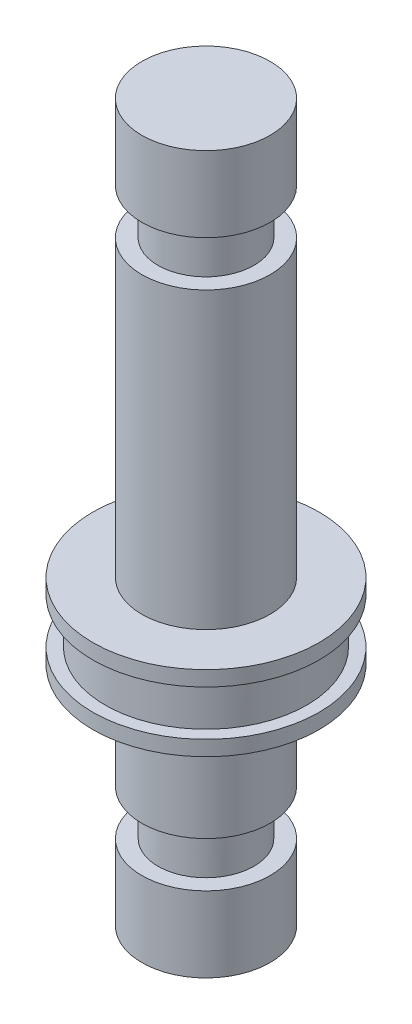
ISO-10303-21;
HEADER;
FILE_DESCRIPTION(('STEP AP214'),'2;1');
FILE_NAME('part.step','',(''),(''),'','','');
FILE_SCHEMA(('AUTOMOTIVE_DESIGN { 1 0 10303 214 1 1 1 1 }'));
ENDSEC;
DATA;
#1=APPLICATION_CONTEXT('core data for automotive mechanical design processes');
#2=APPLICATION_PROTOCOL_DEFINITION('international standard','automotive_design',2000,#1);
#3=PRODUCT_CONTEXT('',#1,'mechanical');
#4=PRODUCT('Part','Part','',(#3));
#5=PRODUCT_RELATED_PRODUCT_CATEGORY('part','',(#4));
#6=PRODUCT_DEFINITION_FORMATION('','',#4);
#7=PRODUCT_DEFINITION_CONTEXT('part definition',#1,'design');
#8=PRODUCT_DEFINITION('design','',#6,#7);
#9=PRODUCT_DEFINITION_SHAPE('','',#8);
#10=(LENGTH_UNIT() NAMED_UNIT(*) SI_UNIT(.MILLI.,.METRE.));
#11=(NAMED_UNIT(*) PLANE_ANGLE_UNIT() SI_UNIT($,.RADIAN.));
#12=(NAMED_UNIT(*) SI_UNIT($,.STERADIAN.) SOLID_ANGLE_UNIT());
#13=UNCERTAINTY_MEASURE_WITH_UNIT(LENGTH_MEASURE(1.E-05),#10,'distance_accuracy_value','');
#14=(GEOMETRIC_REPRESENTATION_CONTEXT(3) GLOBAL_UNCERTAINTY_ASSIGNED_CONTEXT((#13)) GLOBAL_UNIT_ASSIGNED_CONTEXT((#10,
#11,#12)) REPRESENTATION_CONTEXT('',''));
#15=CARTESIAN_POINT('',(0.,0.,0.));
#16=DIRECTION('',(0.,0.,1.));
#17=DIRECTION('',(1.,0.,0.));
#18=AXIS2_PLACEMENT_3D('',#15,#16,#17);
#19=CARTESIAN_POINT('',(0.,65.,0.));
#20=DIRECTION('',(0.,-1.,0.));
#21=DIRECTION('',(0.,0.,-1.));
#22=AXIS2_PLACEMENT_3D('',#19,#20,#21);
#23=CYLINDRICAL_SURFACE('',#22,6.365);
#24=CARTESIAN_POINT('',(0.,49.,0.));
#25=DIRECTION('',(0.,1.,0.));
#26=DIRECTION('',(0.,0.,1.));
#27=AXIS2_PLACEMENT_3D('',#24,#25,#26);
#28=CIRCLE('',#27,6.365);
#29=CARTESIAN_POINT('',(0.,49.,6.365));
#30=VERTEX_POINT('',#29);
#31=EDGE_CURVE('E12',#30,#30,#28,.F.);
#32=ORIENTED_EDGE('',*,*,#31,.F.);
#33=EDGE_LOOP('',(#32));
#34=FACE_BOUND('',#33,.T.);
#35=CARTESIAN_POINT('',(0.,55.,0.));
#36=DIRECTION('',(0.,1.,0.));
#37=DIRECTION('',(0.,0.,1.));
#38=AXIS2_PLACEMENT_3D('',#35,#36,#37);
#39=CIRCLE('',#38,6.365);
#40=CARTESIAN_POINT('',(0.,55.,6.365));
#41=VERTEX_POINT('',#40);
#42=EDGE_CURVE('E53',#41,#41,#39,.F.);
#43=ORIENTED_EDGE('',*,*,#42,.T.);
#44=EDGE_LOOP('',(#43));
#45=FACE_BOUND('',#44,.T.);
#46=ADVANCED_FACE('F34',(#34,#45),#23,.T.);
#47=CARTESIAN_POINT('',(0.,55.,0.));
#48=DIRECTION('',(0.,1.,0.));
#49=DIRECTION('',(0.,0.,1.));
#50=AXIS2_PLACEMENT_3D('',#47,#48,#49);
#51=CYLINDRICAL_SURFACE('',#50,8.5);
#52=CARTESIAN_POINT('',(0.,55.,0.));
#53=DIRECTION('',(0.,1.,0.));
#54=DIRECTION('',(0.,0.,1.));
#55=AXIS2_PLACEMENT_3D('',#52,#53,#54);
#56=CIRCLE('',#55,8.5);
#57=CARTESIAN_POINT('',(0.,55.,8.5));
#58=VERTEX_POINT('',#57);
#59=EDGE_CURVE('E62',#58,#58,#56,.T.);
#60=ORIENTED_EDGE('',*,*,#59,.T.);
#61=EDGE_LOOP('',(#60));
#62=FACE_BOUND('',#61,.T.);
#63=CARTESIAN_POINT('',(0.,65.,0.));
#64=DIRECTION('',(0.,1.,0.));
#65=DIRECTION('',(0.,0.,1.));
#66=AXIS2_PLACEMENT_3D('',#63,#64,#65);
#67=CIRCLE('',#66,8.5);
#68=CARTESIAN_POINT('',(0.,65.,8.5));
#69=VERTEX_POINT('',#68);
#70=EDGE_CURVE('E57',#69,#69,#67,.T.);
#71=ORIENTED_EDGE('',*,*,#70,.F.);
#72=EDGE_LOOP('',(#71));
#73=FACE_BOUND('',#72,.T.);
#74=ADVANCED_FACE('F125',(#62,#73),#51,.T.);
#75=CARTESIAN_POINT('',(0.,55.,0.));
#76=DIRECTION('',(0.,1.,0.));
#77=DIRECTION('',(0.,0.,1.));
#78=AXIS2_PLACEMENT_3D('',#75,#76,#77);
#79=PLANE('',#78);
#80=ORIENTED_EDGE('',*,*,#42,.F.);
#81=EDGE_LOOP('',(#80));
#82=FACE_BOUND('',#81,.T.);
#83=ORIENTED_EDGE('',*,*,#59,.F.);
#84=EDGE_LOOP('',(#83));
#85=FACE_BOUND('',#84,.T.);
#86=ADVANCED_FACE('F131',(#82,#85),#79,.F.);
#87=CARTESIAN_POINT('',(0.,65.,0.));
#88=DIRECTION('',(0.,-1.,0.));
#89=DIRECTION('',(0.,0.,-1.));
#90=AXIS2_PLACEMENT_3D('',#87,#88,#89);
#91=PLANE('',#90);
#92=ORIENTED_EDGE('',*,*,#70,.T.);
#93=EDGE_LOOP('',(#92));
#94=FACE_BOUND('',#93,.T.);
#95=ADVANCED_FACE('F249',(#94),#91,.F.);
#96=CARTESIAN_POINT('',(0.,79.0416305603426,0.));
#97=DIRECTION('',(0.,-1.,0.));
#98=DIRECTION('',(0.,0.,-1.));
#99=AXIS2_PLACEMENT_3D('',#96,#97,#98);
#100=CYLINDRICAL_SURFACE('',#99,8.5);
#101=CARTESIAN_POINT('',(0.,9.99999999999999,0.));
#102=DIRECTION('',(0.,1.,0.));
#103=DIRECTION('',(0.,0.,1.));
#104=AXIS2_PLACEMENT_3D('',#101,#102,#103);
#105=CIRCLE('',#104,8.5);
#106=CARTESIAN_POINT('',(0.,9.99999999999999,8.5));
#107=VERTEX_POINT('',#106);
#108=EDGE_CURVE('E58',#107,#107,#105,.F.);
#109=ORIENTED_EDGE('',*,*,#108,.F.);
#110=EDGE_LOOP('',(#109));
#111=FACE_BOUND('',#110,.T.);
#112=CARTESIAN_POINT('',(0.,49.,0.));
#113=DIRECTION('',(0.,1.,0.));
#114=DIRECTION('',(0.,0.,1.));
#115=AXIS2_PLACEMENT_3D('',#112,#113,#114);
#116=CIRCLE('',#115,8.5);
#117=CARTESIAN_POINT('',(0.,49.,8.5));
#118=VERTEX_POINT('',#117);
#119=EDGE_CURVE('E65',#118,#118,#116,.T.);
#120=ORIENTED_EDGE('',*,*,#119,.F.);
#121=EDGE_LOOP('',(#120));
#122=FACE_BOUND('',#121,.T.);
#123=ADVANCED_FACE('F233',(#111,#122),#100,.T.);
#124=CARTESIAN_POINT('',(0.,49.,0.));
#125=DIRECTION('',(0.,1.,0.));
#126=DIRECTION('',(0.,0.,1.));
#127=AXIS2_PLACEMENT_3D('',#124,#125,#126);
#128=PLANE('',#127);
#129=ORIENTED_EDGE('',*,*,#31,.T.);
#130=EDGE_LOOP('',(#129));
#131=FACE_BOUND('',#130,.T.);
#132=ORIENTED_EDGE('',*,*,#119,.T.);
#133=EDGE_LOOP('',(#132));
#134=FACE_BOUND('',#133,.T.);
#135=ADVANCED_FACE('F193',(#131,#134),#128,.T.);
#136=CARTESIAN_POINT('',(0.,8.,0.));
#137=DIRECTION('',(0.,1.,0.));
#138=DIRECTION('',(0.,0.,1.));
#139=AXIS2_PLACEMENT_3D('',#136,#137,#138);
#140=PLANE('',#139);
#141=CARTESIAN_POINT('',(0.,8.,0.));
#142=DIRECTION('',(0.,1.,0.));
#143=DIRECTION('',(0.,0.,1.));
#144=AXIS2_PLACEMENT_3D('',#141,#142,#143);
#145=CIRCLE('',#144,13.365);
#146=CARTESIAN_POINT('',(0.,8.,13.365));
#147=VERTEX_POINT('',#146);
#148=EDGE_CURVE('E50',#147,#147,#145,.T.);
#149=ORIENTED_EDGE('',*,*,#148,.T.);
#150=EDGE_LOOP('',(#149));
#151=FACE_BOUND('',#150,.T.);
#152=CARTESIAN_POINT('',(0.,8.,0.));
#153=DIRECTION('',(0.,1.,0.));
#154=DIRECTION('',(0.,0.,1.));
#155=AXIS2_PLACEMENT_3D('',#152,#153,#154);
#156=CIRCLE('',#155,15.);
#157=CARTESIAN_POINT('',(0.,8.,15.));
#158=VERTEX_POINT('',#157);
#159=EDGE_CURVE('E90',#158,#158,#156,.T.);
#160=ORIENTED_EDGE('',*,*,#159,.F.);
#161=EDGE_LOOP('',(#160));
#162=FACE_BOUND('',#161,.T.);
#163=ADVANCED_FACE('F187',(#151,#162),#140,.F.);
#164=CARTESIAN_POINT('',(0.,8.,0.));
#165=DIRECTION('',(0.,1.,0.));
#166=DIRECTION('',(0.,0.,1.));
#167=AXIS2_PLACEMENT_3D('',#164,#165,#166);
#168=CYLINDRICAL_SURFACE('',#167,15.);
#169=ORIENTED_EDGE('',*,*,#159,.T.);
#170=EDGE_LOOP('',(#169));
#171=FACE_BOUND('',#170,.T.);
#172=CARTESIAN_POINT('',(0.,10.,0.));
#173=DIRECTION('',(0.,1.,0.));
#174=DIRECTION('',(0.,0.,1.));
#175=AXIS2_PLACEMENT_3D('',#172,#173,#174);
#176=CIRCLE('',#175,15.);
#177=CARTESIAN_POINT('',(0.,10.,15.));
#178=VERTEX_POINT('',#177);
#179=EDGE_CURVE('E86',#178,#178,#176,.T.);
#180=ORIENTED_EDGE('',*,*,#179,.F.);
#181=EDGE_LOOP('',(#180));
#182=FACE_BOUND('',#181,.T.);
#183=ADVANCED_FACE('F192',(#171,#182),#168,.T.);
#184=CARTESIAN_POINT('',(0.,10.,0.));
#185=DIRECTION('',(0.,1.,0.));
#186=DIRECTION('',(0.,0.,1.));
#187=AXIS2_PLACEMENT_3D('',#184,#185,#186);
#188=PLANE('',#187);
#189=ORIENTED_EDGE('',*,*,#108,.T.);
#190=EDGE_LOOP('',(#189));
#191=FACE_BOUND('',#190,.T.);
#192=ORIENTED_EDGE('',*,*,#179,.T.);
#193=EDGE_LOOP('',(#192));
#194=FACE_BOUND('',#193,.T.);
#195=ADVANCED_FACE('F180',(#191,#194),#188,.T.);
#196=CARTESIAN_POINT('',(0.,10.,0.));
#197=DIRECTION('',(0.,-1.,0.));
#198=DIRECTION('',(0.,0.,-1.));
#199=AXIS2_PLACEMENT_3D('',#196,#197,#198);
#200=CYLINDRICAL_SURFACE('',#199,13.365);
#201=ORIENTED_EDGE('',*,*,#148,.F.);
#202=EDGE_LOOP('',(#201));
#203=FACE_BOUND('',#202,.T.);
#204=CARTESIAN_POINT('',(0.,2.,0.));
#205=DIRECTION('',(0.,-1.,0.));
#206=DIRECTION('',(0.,0.,-1.));
#207=AXIS2_PLACEMENT_3D('',#204,#205,#206);
#208=CIRCLE('',#207,13.365);
#209=CARTESIAN_POINT('',(0.,2.,-13.365));
#210=VERTEX_POINT('',#209);
#211=EDGE_CURVE('E45',#210,#210,#208,.T.);
#212=ORIENTED_EDGE('',*,*,#211,.F.);
#213=EDGE_LOOP('',(#212));
#214=FACE_BOUND('',#213,.T.);
#215=ADVANCED_FACE('F36',(#203,#214),#200,.T.);
#216=CARTESIAN_POINT('',(0.,2.,0.));
#217=DIRECTION('',(0.,-1.,0.));
#218=DIRECTION('',(0.,0.,-1.));
#219=AXIS2_PLACEMENT_3D('',#216,#217,#218);
#220=PLANE('',#219);
#221=ORIENTED_EDGE('',*,*,#211,.T.);
#222=EDGE_LOOP('',(#221));
#223=FACE_BOUND('',#222,.T.);
#224=CARTESIAN_POINT('',(0.,2.,0.));
#225=DIRECTION('',(0.,-1.,0.));
#226=DIRECTION('',(0.,0.,-1.));
#227=AXIS2_PLACEMENT_3D('',#224,#225,#226);
#228=CIRCLE('',#227,15.);
#229=CARTESIAN_POINT('',(0.,2.,-15.));
#230=VERTEX_POINT('',#229);
#231=EDGE_CURVE('E83',#230,#230,#228,.T.);
#232=ORIENTED_EDGE('',*,*,#231,.F.);
#233=EDGE_LOOP('',(#232));
#234=FACE_BOUND('',#233,.T.);
#235=ADVANCED_FACE('F154',(#223,#234),#220,.F.);
#236=CARTESIAN_POINT('',(0.,2.,0.));
#237=DIRECTION('',(0.,-1.,0.));
#238=DIRECTION('',(0.,0.,-1.));
#239=AXIS2_PLACEMENT_3D('',#236,#237,#238);
#240=CYLINDRICAL_SURFACE('',#239,15.);
#241=ORIENTED_EDGE('',*,*,#231,.T.);
#242=EDGE_LOOP('',(#241));
#243=FACE_BOUND('',#242,.T.);
#244=CARTESIAN_POINT('',(0.,0.,0.));
#245=DIRECTION('',(0.,-1.,0.));
#246=DIRECTION('',(0.,0.,-1.));
#247=AXIS2_PLACEMENT_3D('',#244,#245,#246);
#248=CIRCLE('',#247,15.);
#249=CARTESIAN_POINT('',(0.,0.,-15.));
#250=VERTEX_POINT('',#249);
#251=EDGE_CURVE('E87',#250,#250,#248,.T.);
#252=ORIENTED_EDGE('',*,*,#251,.F.);
#253=EDGE_LOOP('',(#252));
#254=FACE_BOUND('',#253,.T.);
#255=ADVANCED_FACE('F159',(#243,#254),#240,.T.);
#256=CARTESIAN_POINT('',(0.,0.,0.));
#257=DIRECTION('',(0.,1.,0.));
#258=DIRECTION('',(0.,0.,1.));
#259=AXIS2_PLACEMENT_3D('',#256,#257,#258);
#260=PLANE('',#259);
#261=CARTESIAN_POINT('',(0.,0.,0.));
#262=DIRECTION('',(0.,1.,0.));
#263=DIRECTION('',(0.,0.,1.));
#264=AXIS2_PLACEMENT_3D('',#261,#262,#263);
#265=CIRCLE('',#264,8.5);
#266=CARTESIAN_POINT('',(0.,0.,8.5));
#267=VERTEX_POINT('',#266);
#268=EDGE_CURVE('E41',#267,#267,#265,.F.);
#269=ORIENTED_EDGE('',*,*,#268,.F.);
#270=EDGE_LOOP('',(#269));
#271=FACE_BOUND('',#270,.T.);
#272=ORIENTED_EDGE('',*,*,#251,.T.);
#273=EDGE_LOOP('',(#272));
#274=FACE_BOUND('',#273,.T.);
#275=ADVANCED_FACE('F170',(#271,#274),#260,.F.);
#276=CARTESIAN_POINT('',(0.,-14.,0.));
#277=DIRECTION('',(0.,1.,0.));
#278=DIRECTION('',(0.,0.,1.));
#279=AXIS2_PLACEMENT_3D('',#276,#277,#278);
#280=CIRCLE('',#279,8.5);
#281=CARTESIAN_POINT('',(0.,-14.,8.5));
#282=VERTEX_POINT('',#281);
#283=EDGE_CURVE('E70',#282,#282,#280,.T.);
#284=ORIENTED_EDGE('',*,*,#283,.T.);
#285=EDGE_LOOP('',(#284));
#286=FACE_BOUND('',#285,.T.);
#287=ORIENTED_EDGE('',*,*,#268,.T.);
#288=EDGE_LOOP('',(#287));
#289=FACE_BOUND('',#288,.T.);
#290=ADVANCED_FACE('F120',(#286,#289),#100,.T.);
#291=CARTESIAN_POINT('',(0.,-14.,0.));
#292=DIRECTION('',(0.,1.,0.));
#293=DIRECTION('',(0.,0.,1.));
#294=AXIS2_PLACEMENT_3D('',#291,#292,#293);
#295=PLANE('',#294);
#296=CARTESIAN_POINT('',(0.,-14.,0.));
#297=DIRECTION('',(0.,1.,0.));
#298=DIRECTION('',(0.,0.,1.));
#299=AXIS2_PLACEMENT_3D('',#296,#297,#298);
#300=CIRCLE('',#299,6.365);
#301=CARTESIAN_POINT('',(0.,-14.,6.365));
#302=VERTEX_POINT('',#301);
#303=EDGE_CURVE('E55',#302,#302,#300,.F.);
#304=ORIENTED_EDGE('',*,*,#303,.F.);
#305=EDGE_LOOP('',(#304));
#306=FACE_BOUND('',#305,.T.);
#307=ORIENTED_EDGE('',*,*,#283,.F.);
#308=EDGE_LOOP('',(#307));
#309=FACE_BOUND('',#308,.T.);
#310=ADVANCED_FACE('F115',(#306,#309),#295,.F.);
#311=CARTESIAN_POINT('',(0.,-30.,0.));
#312=DIRECTION('',(0.,-1.,0.));
#313=DIRECTION('',(0.,0.,-1.));
#314=AXIS2_PLACEMENT_3D('',#311,#312,#313);
#315=PLANE('',#314);
#316=CARTESIAN_POINT('',(0.,-30.,0.));
#317=DIRECTION('',(0.,-1.,0.));
#318=DIRECTION('',(0.,0.,-1.));
#319=AXIS2_PLACEMENT_3D('',#316,#317,#318);
#320=CIRCLE('',#319,8.5);
#321=CARTESIAN_POINT('',(0.,-30.,-8.5));
#322=VERTEX_POINT('',#321);
#323=EDGE_CURVE('E80',#322,#322,#320,.T.);
#324=ORIENTED_EDGE('',*,*,#323,.T.);
#325=EDGE_LOOP('',(#324));
#326=FACE_BOUND('',#325,.T.);
#327=ADVANCED_FACE('F110',(#326),#315,.T.);
#328=CARTESIAN_POINT('',(0.,-20.,0.));
#329=DIRECTION('',(0.,-1.,0.));
#330=DIRECTION('',(0.,0.,-1.));
#331=AXIS2_PLACEMENT_3D('',#328,#329,#330);
#332=CYLINDRICAL_SURFACE('',#331,8.5);
#333=CARTESIAN_POINT('',(0.,-20.,0.));
#334=DIRECTION('',(0.,-1.,0.));
#335=DIRECTION('',(0.,0.,-1.));
#336=AXIS2_PLACEMENT_3D('',#333,#334,#335);
#337=CIRCLE('',#336,8.5);
#338=CARTESIAN_POINT('',(0.,-20.,-8.5));
#339=VERTEX_POINT('',#338);
#340=EDGE_CURVE('E76',#339,#339,#337,.T.);
#341=ORIENTED_EDGE('',*,*,#340,.T.);
#342=EDGE_LOOP('',(#341));
#343=FACE_BOUND('',#342,.T.);
#344=ORIENTED_EDGE('',*,*,#323,.F.);
#345=EDGE_LOOP('',(#344));
#346=FACE_BOUND('',#345,.T.);
#347=ADVANCED_FACE('F104',(#343,#346),#332,.T.);
#348=CARTESIAN_POINT('',(0.,-20.,0.));
#349=DIRECTION('',(0.,-1.,0.));
#350=DIRECTION('',(0.,0.,-1.));
#351=AXIS2_PLACEMENT_3D('',#348,#349,#350);
#352=PLANE('',#351);
#353=CARTESIAN_POINT('',(0.,-20.,0.));
#354=DIRECTION('',(0.,-1.,0.));
#355=DIRECTION('',(0.,0.,-1.));
#356=AXIS2_PLACEMENT_3D('',#353,#354,#355);
#357=CIRCLE('',#356,6.365);
#358=CARTESIAN_POINT('',(0.,-20.,-6.365));
#359=VERTEX_POINT('',#358);
#360=EDGE_CURVE('E79',#359,#359,#357,.F.);
#361=ORIENTED_EDGE('',*,*,#360,.F.);
#362=EDGE_LOOP('',(#361));
#363=FACE_BOUND('',#362,.T.);
#364=ORIENTED_EDGE('',*,*,#340,.F.);
#365=EDGE_LOOP('',(#364));
#366=FACE_BOUND('',#365,.T.);
#367=ADVANCED_FACE('F101',(#363,#366),#352,.F.);
#368=ORIENTED_EDGE('',*,*,#360,.T.);
#369=EDGE_LOOP('',(#368));
#370=FACE_BOUND('',#369,.T.);
#371=ORIENTED_EDGE('',*,*,#303,.T.);
#372=EDGE_LOOP('',(#371));
#373=FACE_BOUND('',#372,.T.);
#374=ADVANCED_FACE('F99',(#370,#373),#23,.T.);
#375=CLOSED_SHELL('',(#46,#74,#86,#95,#123,#135,#163,#183,#195,#215,#235,#255,#275,#290,#310,
#327,#347,#367,#374));
#376=MANIFOLD_SOLID_BREP('B2',#375);
#377=ADVANCED_BREP_SHAPE_REPRESENTATION('',(#18,#376),#14);
#378=SHAPE_DEFINITION_REPRESENTATION(#9,#377);
ENDSEC;
END-ISO-10303-21;
